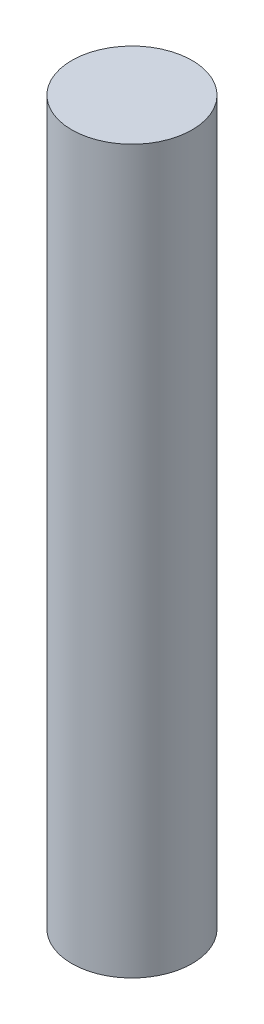
ISO-10303-21;
HEADER;
FILE_DESCRIPTION(('STEP AP214'),'2;1');
FILE_NAME('part.step','',(''),(''),'','','');
FILE_SCHEMA(('AUTOMOTIVE_DESIGN { 1 0 10303 214 1 1 1 1 }'));
ENDSEC;
DATA;
#1=APPLICATION_CONTEXT('core data for automotive mechanical design processes');
#2=APPLICATION_PROTOCOL_DEFINITION('international standard','automotive_design',2000,#1);
#3=PRODUCT_CONTEXT('',#1,'mechanical');
#4=PRODUCT('Part','Part','',(#3));
#5=PRODUCT_RELATED_PRODUCT_CATEGORY('part','',(#4));
#6=PRODUCT_DEFINITION_FORMATION('','',#4);
#7=PRODUCT_DEFINITION_CONTEXT('part definition',#1,'design');
#8=PRODUCT_DEFINITION('design','',#6,#7);
#9=PRODUCT_DEFINITION_SHAPE('','',#8);
#10=(LENGTH_UNIT() NAMED_UNIT(*) SI_UNIT(.MILLI.,.METRE.));
#11=(NAMED_UNIT(*) PLANE_ANGLE_UNIT() SI_UNIT($,.RADIAN.));
#12=(NAMED_UNIT(*) SI_UNIT($,.STERADIAN.) SOLID_ANGLE_UNIT());
#13=UNCERTAINTY_MEASURE_WITH_UNIT(LENGTH_MEASURE(1.E-05),#10,'distance_accuracy_value','');
#14=(GEOMETRIC_REPRESENTATION_CONTEXT(3) GLOBAL_UNCERTAINTY_ASSIGNED_CONTEXT((#13)) GLOBAL_UNIT_ASSIGNED_CONTEXT((#10,
#11,#12)) REPRESENTATION_CONTEXT('',''));
#15=CARTESIAN_POINT('',(0.,0.,0.));
#16=DIRECTION('',(0.,0.,1.));
#17=DIRECTION('',(1.,0.,0.));
#18=AXIS2_PLACEMENT_3D('',#15,#16,#17);
#19=CARTESIAN_POINT('',(0.,30.,0.));
#20=DIRECTION('',(0.,-1.,0.));
#21=DIRECTION('',(0.,0.,-1.));
#22=AXIS2_PLACEMENT_3D('',#19,#20,#21);
#23=CYLINDRICAL_SURFACE('',#22,2.5);
#24=CARTESIAN_POINT('',(0.,30.,0.));
#25=DIRECTION('',(0.,1.,0.));
#26=DIRECTION('',(0.,0.,1.));
#27=AXIS2_PLACEMENT_3D('',#24,#25,#26);
#28=CIRCLE('',#27,2.5);
#29=CARTESIAN_POINT('',(0.,30.,2.5));
#30=VERTEX_POINT('',#29);
#31=EDGE_CURVE('E10',#30,#30,#28,.T.);
#32=ORIENTED_EDGE('',*,*,#31,.F.);
#33=EDGE_LOOP('',(#32));
#34=FACE_BOUND('',#33,.T.);
#35=CARTESIAN_POINT('',(0.,0.,0.));
#36=DIRECTION('',(0.,1.,0.));
#37=DIRECTION('',(0.,0.,1.));
#38=AXIS2_PLACEMENT_3D('',#35,#36,#37);
#39=CIRCLE('',#38,2.5);
#40=CARTESIAN_POINT('',(0.,0.,2.5));
#41=VERTEX_POINT('',#40);
#42=EDGE_CURVE('E33',#41,#41,#39,.T.);
#43=ORIENTED_EDGE('',*,*,#42,.T.);
#44=EDGE_LOOP('',(#43));
#45=FACE_BOUND('',#44,.T.);
#46=ADVANCED_FACE('F30',(#34,#45),#23,.T.);
#47=CARTESIAN_POINT('',(0.,30.,0.));
#48=DIRECTION('',(0.,1.,0.));
#49=DIRECTION('',(0.,0.,1.));
#50=AXIS2_PLACEMENT_3D('',#47,#48,#49);
#51=PLANE('',#50);
#52=ORIENTED_EDGE('',*,*,#31,.T.);
#53=EDGE_LOOP('',(#52));
#54=FACE_BOUND('',#53,.T.);
#55=ADVANCED_FACE('F45',(#54),#51,.T.);
#56=CARTESIAN_POINT('',(0.,0.,0.));
#57=DIRECTION('',(0.,1.,0.));
#58=DIRECTION('',(0.,0.,1.));
#59=AXIS2_PLACEMENT_3D('',#56,#57,#58);
#60=PLANE('',#59);
#61=ORIENTED_EDGE('',*,*,#42,.F.);
#62=EDGE_LOOP('',(#61));
#63=FACE_BOUND('',#62,.T.);
#64=ADVANCED_FACE('F43',(#63),#60,.F.);
#65=CLOSED_SHELL('',(#46,#55,#64));
#66=MANIFOLD_SOLID_BREP('B2',#65);
#67=ADVANCED_BREP_SHAPE_REPRESENTATION('',(#18,#66),#14);
#68=SHAPE_DEFINITION_REPRESENTATION(#9,#67);
ENDSEC;
END-ISO-10303-21;
